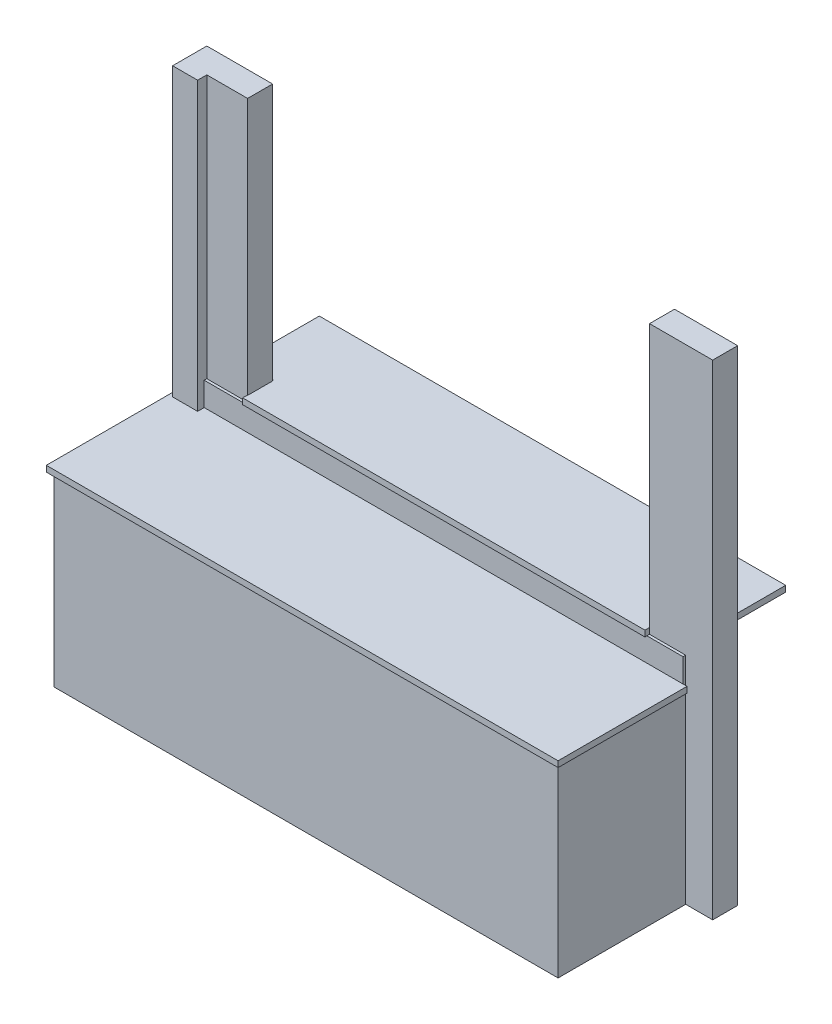
ISO-10303-21;
HEADER;
FILE_DESCRIPTION(('STEP AP214'),'2;1');
FILE_NAME('part.step','',(''),(''),'','','');
FILE_SCHEMA(('AUTOMOTIVE_DESIGN { 1 0 10303 214 1 1 1 1 }'));
ENDSEC;
DATA;
#1=APPLICATION_CONTEXT('core data for automotive mechanical design processes');
#2=APPLICATION_PROTOCOL_DEFINITION('international standard','automotive_design',2000,#1);
#3=PRODUCT_CONTEXT('',#1,'mechanical');
#4=PRODUCT('Part','Part','',(#3));
#5=PRODUCT_RELATED_PRODUCT_CATEGORY('part','',(#4));
#6=PRODUCT_DEFINITION_FORMATION('','',#4);
#7=PRODUCT_DEFINITION_CONTEXT('part definition',#1,'design');
#8=PRODUCT_DEFINITION('design','',#6,#7);
#9=PRODUCT_DEFINITION_SHAPE('','',#8);
#10=(LENGTH_UNIT() NAMED_UNIT(*) SI_UNIT(.MILLI.,.METRE.));
#11=(NAMED_UNIT(*) PLANE_ANGLE_UNIT() SI_UNIT($,.RADIAN.));
#12=(NAMED_UNIT(*) SI_UNIT($,.STERADIAN.) SOLID_ANGLE_UNIT());
#13=UNCERTAINTY_MEASURE_WITH_UNIT(LENGTH_MEASURE(1.E-05),#10,'distance_accuracy_value','');
#14=(GEOMETRIC_REPRESENTATION_CONTEXT(3) GLOBAL_UNCERTAINTY_ASSIGNED_CONTEXT((#13)) GLOBAL_UNIT_ASSIGNED_CONTEXT((#10,
#11,#12)) REPRESENTATION_CONTEXT('',''));
#15=CARTESIAN_POINT('',(0.,0.,0.));
#16=DIRECTION('',(0.,0.,1.));
#17=DIRECTION('',(1.,0.,0.));
#18=AXIS2_PLACEMENT_3D('',#15,#16,#17);
#19=CARTESIAN_POINT('',(1041.4,142.875,-301.625));
#20=DIRECTION('',(-1.,0.,0.));
#21=DIRECTION('',(0.,0.,1.));
#22=AXIS2_PLACEMENT_3D('',#19,#20,#21);
#23=PLANE('',#22);
#24=DIRECTION('',(0.,0.,-1.));
#25=VECTOR('',#24,1.);
#26=CARTESIAN_POINT('',(1041.4,114.3,-301.625));
#27=LINE('',#26,#25);
#28=CARTESIAN_POINT('',(1041.4,114.3,-311.15));
#29=VERTEX_POINT('',#28);
#30=CARTESIAN_POINT('',(1041.4,114.3,-323.85));
#31=VERTEX_POINT('',#30);
#32=EDGE_CURVE('E377',#29,#31,#27,.T.);
#33=ORIENTED_EDGE('',*,*,#32,.T.);
#34=DIRECTION('',(0.,1.,0.));
#35=VECTOR('',#34,1.);
#36=CARTESIAN_POINT('',(1041.4,-1254.91010127816,-323.85));
#37=LINE('',#36,#35);
#38=CARTESIAN_POINT('',(1041.4,142.875,-323.85));
#39=VERTEX_POINT('',#38);
#40=EDGE_CURVE('E260',#31,#39,#37,.T.);
#41=ORIENTED_EDGE('',*,*,#40,.T.);
#42=DIRECTION('',(0.,0.,-1.));
#43=VECTOR('',#42,1.);
#44=CARTESIAN_POINT('',(1041.4,142.875,-301.625));
#45=LINE('',#44,#43);
#46=CARTESIAN_POINT('',(1041.4,142.875,-301.625));
#47=VERTEX_POINT('',#46);
#48=EDGE_CURVE('E351',#47,#39,#45,.T.);
#49=ORIENTED_EDGE('',*,*,#48,.F.);
#50=DIRECTION('',(0.,-1.,0.));
#51=VECTOR('',#50,1.);
#52=CARTESIAN_POINT('',(1041.4,142.875,-301.625));
#53=LINE('',#52,#51);
#54=CARTESIAN_POINT('',(1041.4,114.3,-301.625));
#55=VERTEX_POINT('',#54);
#56=EDGE_CURVE('E393',#47,#55,#53,.T.);
#57=ORIENTED_EDGE('',*,*,#56,.T.);
#58=EDGE_CURVE('E373',#55,#29,#27,.T.);
#59=ORIENTED_EDGE('',*,*,#58,.T.);
#60=EDGE_LOOP('',(#33,#41,#49,#57,#59));
#61=FACE_BOUND('',#60,.T.);
#62=ADVANCED_FACE('F39',(#61),#23,.F.);
#63=CARTESIAN_POINT('',(-900.1125,142.875,-450.85));
#64=DIRECTION('',(1.,0.,0.));
#65=DIRECTION('',(0.,0.,-1.));
#66=AXIS2_PLACEMENT_3D('',#63,#64,#65);
#67=PLANE('',#66);
#68=DIRECTION('',(0.,0.,1.));
#69=VECTOR('',#68,1.);
#70=CARTESIAN_POINT('',(-900.1125,114.3,-450.85));
#71=LINE('',#70,#69);
#72=CARTESIAN_POINT('',(-900.1125,114.3,-450.85));
#73=VERTEX_POINT('',#72);
#74=CARTESIAN_POINT('',(-900.1125,114.3,-444.5));
#75=VERTEX_POINT('',#74);
#76=EDGE_CURVE('E366',#73,#75,#71,.T.);
#77=ORIENTED_EDGE('',*,*,#76,.T.);
#78=DIRECTION('',(0.,1.,0.));
#79=VECTOR('',#78,1.);
#80=CARTESIAN_POINT('',(-900.1125,142.875,-444.5));
#81=LINE('',#80,#79);
#82=CARTESIAN_POINT('',(-900.1125,142.875,-444.5));
#83=VERTEX_POINT('',#82);
#84=EDGE_CURVE('E333',#75,#83,#81,.T.);
#85=ORIENTED_EDGE('',*,*,#84,.T.);
#86=DIRECTION('',(0.,0.,1.));
#87=VECTOR('',#86,1.);
#88=CARTESIAN_POINT('',(-900.1125,142.875,-450.85));
#89=LINE('',#88,#87);
#90=CARTESIAN_POINT('',(-900.1125,142.875,-450.85));
#91=VERTEX_POINT('',#90);
#92=EDGE_CURVE('E345',#91,#83,#89,.T.);
#93=ORIENTED_EDGE('',*,*,#92,.F.);
#94=DIRECTION('',(0.,-1.,0.));
#95=VECTOR('',#94,1.);
#96=CARTESIAN_POINT('',(-900.1125,142.875,-450.85));
#97=LINE('',#96,#95);
#98=EDGE_CURVE('E399',#91,#73,#97,.T.);
#99=ORIENTED_EDGE('',*,*,#98,.T.);
#100=EDGE_LOOP('',(#77,#85,#93,#99));
#101=FACE_BOUND('',#100,.T.);
#102=ADVANCED_FACE('F566',(#101),#67,.F.);
#103=CARTESIAN_POINT('',(0.,114.3,0.));
#104=DIRECTION('',(0.,-1.,0.));
#105=DIRECTION('',(0.,0.,-1.));
#106=AXIS2_PLACEMENT_3D('',#103,#104,#105);
#107=PLANE('',#106);
#108=DIRECTION('',(0.,0.,1.));
#109=VECTOR('',#108,1.);
#110=CARTESIAN_POINT('',(1216.025,114.3,-311.15));
#111=LINE('',#110,#109);
#112=CARTESIAN_POINT('',(1216.025,114.3,-323.85));
#113=VERTEX_POINT('',#112);
#114=CARTESIAN_POINT('',(1216.025,114.3,-311.15));
#115=VERTEX_POINT('',#114);
#116=EDGE_CURVE('E408',#113,#115,#111,.T.);
#117=ORIENTED_EDGE('',*,*,#116,.F.);
#118=DIRECTION('',(-1.,0.,0.));
#119=VECTOR('',#118,1.);
#120=CARTESIAN_POINT('',(0.,114.3,-323.85));
#121=LINE('',#120,#119);
#122=EDGE_CURVE('E293',#113,#31,#121,.T.);
#123=ORIENTED_EDGE('',*,*,#122,.T.);
#124=ORIENTED_EDGE('',*,*,#32,.F.);
#125=DIRECTION('',(-1.,0.,0.));
#126=VECTOR('',#125,1.);
#127=CARTESIAN_POINT('',(1216.025,114.3,-311.15));
#128=LINE('',#127,#126);
#129=EDGE_CURVE('E409',#115,#29,#128,.T.);
#130=ORIENTED_EDGE('',*,*,#129,.F.);
#131=EDGE_LOOP('',(#117,#123,#124,#130));
#132=FACE_BOUND('',#131,.T.);
#133=ADVANCED_FACE('F588',(#132),#107,.F.);
#134=CARTESIAN_POINT('',(-900.1125,114.3,-323.85));
#135=VERTEX_POINT('',#134);
#136=CARTESIAN_POINT('',(-900.1125,114.3,-311.15));
#137=VERTEX_POINT('',#136);
#138=EDGE_CURVE('E370',#135,#137,#71,.T.);
#139=ORIENTED_EDGE('',*,*,#138,.F.);
#140=DIRECTION('',(-1.,0.,0.));
#141=VECTOR('',#140,1.);
#142=CARTESIAN_POINT('',(0.,114.3,-323.85));
#143=LINE('',#142,#141);
#144=CARTESIAN_POINT('',(-1095.375,114.3,-323.85));
#145=VERTEX_POINT('',#144);
#146=EDGE_CURVE('E62',#135,#145,#143,.T.);
#147=ORIENTED_EDGE('',*,*,#146,.T.);
#148=DIRECTION('',(0.,0.,1.));
#149=VECTOR('',#148,1.);
#150=CARTESIAN_POINT('',(-1095.375,114.3,0.));
#151=LINE('',#150,#149);
#152=CARTESIAN_POINT('',(-1095.375,114.3,-311.15));
#153=VERTEX_POINT('',#152);
#154=EDGE_CURVE('E335',#145,#153,#151,.T.);
#155=ORIENTED_EDGE('',*,*,#154,.T.);
#156=EDGE_CURVE('E417',#137,#153,#128,.T.);
#157=ORIENTED_EDGE('',*,*,#156,.F.);
#158=EDGE_LOOP('',(#139,#147,#155,#157));
#159=FACE_BOUND('',#158,.T.);
#160=ADVANCED_FACE('F521',(#159),#107,.F.);
#161=CARTESIAN_POINT('',(-1235.075,-28.575,-311.15));
#162=DIRECTION('',(0.,0.,-1.));
#163=DIRECTION('',(-1.,0.,0.));
#164=AXIS2_PLACEMENT_3D('',#161,#162,#163);
#165=PLANE('',#164);
#166=DIRECTION('',(-1.,0.,0.));
#167=VECTOR('',#166,1.);
#168=CARTESIAN_POINT('',(-1235.075,0.,-311.15));
#169=LINE('',#168,#167);
#170=CARTESIAN_POINT('',(-1216.025,0.,-311.15));
#171=VERTEX_POINT('',#170);
#172=CARTESIAN_POINT('',(-1235.075,0.,-311.15));
#173=VERTEX_POINT('',#172);
#174=EDGE_CURVE('E468',#171,#173,#169,.T.);
#175=ORIENTED_EDGE('',*,*,#174,.F.);
#176=DIRECTION('',(0.,-1.,0.));
#177=VECTOR('',#176,1.);
#178=CARTESIAN_POINT('',(-1216.025,3591.40306585183,-311.15));
#179=LINE('',#178,#177);
#180=CARTESIAN_POINT('',(-1216.025,-28.575,-311.15));
#181=VERTEX_POINT('',#180);
#182=EDGE_CURVE('E415',#171,#181,#179,.T.);
#183=ORIENTED_EDGE('',*,*,#182,.T.);
#184=DIRECTION('',(-1.,0.,0.));
#185=VECTOR('',#184,1.);
#186=CARTESIAN_POINT('',(-1235.075,-28.575,-311.15));
#187=LINE('',#186,#185);
#188=CARTESIAN_POINT('',(-1235.075,-28.575,-311.15));
#189=VERTEX_POINT('',#188);
#190=EDGE_CURVE('E454',#181,#189,#187,.T.);
#191=ORIENTED_EDGE('',*,*,#190,.T.);
#192=DIRECTION('',(0.,1.,0.));
#193=VECTOR('',#192,1.);
#194=CARTESIAN_POINT('',(-1235.075,-28.575,-311.15));
#195=LINE('',#194,#193);
#196=EDGE_CURVE('E480',#189,#173,#195,.T.);
#197=ORIENTED_EDGE('',*,*,#196,.T.);
#198=EDGE_LOOP('',(#175,#183,#191,#197));
#199=FACE_BOUND('',#198,.T.);
#200=ADVANCED_FACE('F639',(#199),#165,.T.);
#201=CARTESIAN_POINT('',(1235.075,-28.575,-311.15));
#202=VERTEX_POINT('',#201);
#203=CARTESIAN_POINT('',(1216.025,-28.575,-311.15));
#204=VERTEX_POINT('',#203);
#205=EDGE_CURVE('E456',#202,#204,#187,.T.);
#206=ORIENTED_EDGE('',*,*,#205,.T.);
#207=DIRECTION('',(0.,-1.,0.));
#208=VECTOR('',#207,1.);
#209=CARTESIAN_POINT('',(1216.025,3591.40306585183,-311.15));
#210=LINE('',#209,#208);
#211=CARTESIAN_POINT('',(1216.025,0.,-311.15));
#212=VERTEX_POINT('',#211);
#213=EDGE_CURVE('E405',#212,#204,#210,.T.);
#214=ORIENTED_EDGE('',*,*,#213,.F.);
#215=CARTESIAN_POINT('',(1235.075,0.,-311.15));
#216=VERTEX_POINT('',#215);
#217=EDGE_CURVE('E469',#216,#212,#169,.T.);
#218=ORIENTED_EDGE('',*,*,#217,.F.);
#219=DIRECTION('',(0.,1.,0.));
#220=VECTOR('',#219,1.);
#221=CARTESIAN_POINT('',(1235.075,-28.575,-311.15));
#222=LINE('',#221,#220);
#223=EDGE_CURVE('E465',#202,#216,#222,.T.);
#224=ORIENTED_EDGE('',*,*,#223,.F.);
#225=EDGE_LOOP('',(#206,#214,#218,#224));
#226=FACE_BOUND('',#225,.T.);
#227=ADVANCED_FACE('F627',(#226),#165,.T.);
#228=CARTESIAN_POINT('',(0.,-28.575,0.));
#229=DIRECTION('',(0.,1.,0.));
#230=DIRECTION('',(0.,0.,1.));
#231=AXIS2_PLACEMENT_3D('',#228,#229,#230);
#232=PLANE('',#231);
#233=DIRECTION('',(0.,0.,-1.));
#234=VECTOR('',#233,1.);
#235=CARTESIAN_POINT('',(-1216.025,-28.575,292.1));
#236=LINE('',#235,#234);
#237=CARTESIAN_POINT('',(-1216.025,-28.575,292.1));
#238=VERTEX_POINT('',#237);
#239=EDGE_CURVE('E423',#238,#181,#236,.T.);
#240=ORIENTED_EDGE('',*,*,#239,.F.);
#241=DIRECTION('',(-1.,0.,0.));
#242=VECTOR('',#241,1.);
#243=CARTESIAN_POINT('',(-1216.025,-28.575,292.1));
#244=LINE('',#243,#242);
#245=CARTESIAN_POINT('',(1216.025,-28.575,292.1));
#246=VERTEX_POINT('',#245);
#247=EDGE_CURVE('E428',#246,#238,#244,.T.);
#248=ORIENTED_EDGE('',*,*,#247,.F.);
#249=DIRECTION('',(0.,0.,1.));
#250=VECTOR('',#249,1.);
#251=CARTESIAN_POINT('',(1216.025,-28.575,292.1));
#252=LINE('',#251,#250);
#253=EDGE_CURVE('E437',#204,#246,#252,.T.);
#254=ORIENTED_EDGE('',*,*,#253,.F.);
#255=ORIENTED_EDGE('',*,*,#205,.F.);
#256=DIRECTION('',(0.,0.,-1.));
#257=VECTOR('',#256,1.);
#258=CARTESIAN_POINT('',(1235.075,-28.575,-311.15));
#259=LINE('',#258,#257);
#260=CARTESIAN_POINT('',(1235.075,-28.575,311.15));
#261=VERTEX_POINT('',#260);
#262=EDGE_CURVE('E451',#261,#202,#259,.T.);
#263=ORIENTED_EDGE('',*,*,#262,.F.);
#264=DIRECTION('',(1.,0.,0.));
#265=VECTOR('',#264,1.);
#266=CARTESIAN_POINT('',(-1235.075,-28.575,311.15));
#267=LINE('',#266,#265);
#268=CARTESIAN_POINT('',(-1235.075,-28.575,311.15));
#269=VERTEX_POINT('',#268);
#270=EDGE_CURVE('E462',#269,#261,#267,.T.);
#271=ORIENTED_EDGE('',*,*,#270,.F.);
#272=DIRECTION('',(0.,0.,1.));
#273=VECTOR('',#272,1.);
#274=CARTESIAN_POINT('',(-1235.075,-28.575,-311.15));
#275=LINE('',#274,#273);
#276=EDGE_CURVE('E459',#189,#269,#275,.T.);
#277=ORIENTED_EDGE('',*,*,#276,.F.);
#278=ORIENTED_EDGE('',*,*,#190,.F.);
#279=EDGE_LOOP('',(#240,#248,#254,#255,#263,#271,#277,#278));
#280=FACE_BOUND('',#279,.T.);
#281=ADVANCED_FACE('F624',(#280),#232,.F.);
#282=CARTESIAN_POINT('',(1235.075,-28.575,-311.15));
#283=DIRECTION('',(1.,0.,0.));
#284=DIRECTION('',(0.,0.,-1.));
#285=AXIS2_PLACEMENT_3D('',#282,#283,#284);
#286=PLANE('',#285);
#287=DIRECTION('',(0.,0.,-1.));
#288=VECTOR('',#287,1.);
#289=CARTESIAN_POINT('',(1235.075,0.,-311.15));
#290=LINE('',#289,#288);
#291=CARTESIAN_POINT('',(1235.075,0.,311.15));
#292=VERTEX_POINT('',#291);
#293=EDGE_CURVE('E450',#292,#216,#290,.T.);
#294=ORIENTED_EDGE('',*,*,#293,.F.);
#295=DIRECTION('',(0.,1.,0.));
#296=VECTOR('',#295,1.);
#297=CARTESIAN_POINT('',(1235.075,-28.575,311.15));
#298=LINE('',#297,#296);
#299=EDGE_CURVE('E440',#261,#292,#298,.T.);
#300=ORIENTED_EDGE('',*,*,#299,.F.);
#301=ORIENTED_EDGE('',*,*,#262,.T.);
#302=ORIENTED_EDGE('',*,*,#223,.T.);
#303=EDGE_LOOP('',(#294,#300,#301,#302));
#304=FACE_BOUND('',#303,.T.);
#305=ADVANCED_FACE('F41',(#304),#286,.T.);
#306=CARTESIAN_POINT('',(-1235.075,-28.575,311.15));
#307=DIRECTION('',(0.,0.,1.));
#308=DIRECTION('',(1.,0.,0.));
#309=AXIS2_PLACEMENT_3D('',#306,#307,#308);
#310=PLANE('',#309);
#311=DIRECTION('',(1.,0.,0.));
#312=VECTOR('',#311,1.);
#313=CARTESIAN_POINT('',(-1235.075,0.,311.15));
#314=LINE('',#313,#312);
#315=CARTESIAN_POINT('',(-1235.075,0.,311.15));
#316=VERTEX_POINT('',#315);
#317=EDGE_CURVE('E455',#316,#292,#314,.T.);
#318=ORIENTED_EDGE('',*,*,#317,.F.);
#319=DIRECTION('',(0.,1.,0.));
#320=VECTOR('',#319,1.);
#321=CARTESIAN_POINT('',(-1235.075,-28.575,311.15));
#322=LINE('',#321,#320);
#323=EDGE_CURVE('E478',#269,#316,#322,.T.);
#324=ORIENTED_EDGE('',*,*,#323,.F.);
#325=ORIENTED_EDGE('',*,*,#270,.T.);
#326=ORIENTED_EDGE('',*,*,#299,.T.);
#327=EDGE_LOOP('',(#318,#324,#325,#326));
#328=FACE_BOUND('',#327,.T.);
#329=ADVANCED_FACE('F633',(#328),#310,.T.);
#330=CARTESIAN_POINT('',(-1235.075,-28.575,-311.15));
#331=DIRECTION('',(-1.,0.,0.));
#332=DIRECTION('',(0.,0.,1.));
#333=AXIS2_PLACEMENT_3D('',#330,#331,#332);
#334=PLANE('',#333);
#335=DIRECTION('',(0.,0.,1.));
#336=VECTOR('',#335,1.);
#337=CARTESIAN_POINT('',(-1235.075,0.,-311.15));
#338=LINE('',#337,#336);
#339=EDGE_CURVE('E472',#173,#316,#338,.T.);
#340=ORIENTED_EDGE('',*,*,#339,.F.);
#341=ORIENTED_EDGE('',*,*,#196,.F.);
#342=ORIENTED_EDGE('',*,*,#276,.T.);
#343=ORIENTED_EDGE('',*,*,#323,.T.);
#344=EDGE_LOOP('',(#340,#341,#342,#343));
#345=FACE_BOUND('',#344,.T.);
#346=ADVANCED_FACE('F631',(#345),#334,.T.);
#347=CARTESIAN_POINT('',(0.,0.,0.));
#348=DIRECTION('',(0.,1.,0.));
#349=DIRECTION('',(0.,0.,1.));
#350=AXIS2_PLACEMENT_3D('',#347,#348,#349);
#351=PLANE('',#350);
#352=DIRECTION('',(0.,0.,1.));
#353=VECTOR('',#352,1.);
#354=CARTESIAN_POINT('',(-1095.375,0.,-279.4));
#355=LINE('',#354,#353);
#356=CARTESIAN_POINT('',(-1095.375,0.,-311.15));
#357=VERTEX_POINT('',#356);
#358=CARTESIAN_POINT('',(-1095.375,0.,-279.4));
#359=VERTEX_POINT('',#358);
#360=EDGE_CURVE('E317',#357,#359,#355,.T.);
#361=ORIENTED_EDGE('',*,*,#360,.T.);
#362=DIRECTION('',(-1.,0.,0.));
#363=VECTOR('',#362,1.);
#364=CARTESIAN_POINT('',(-1216.025,0.,-279.4));
#365=LINE('',#364,#363);
#366=CARTESIAN_POINT('',(-1216.025,0.,-279.4));
#367=VERTEX_POINT('',#366);
#368=EDGE_CURVE('E315',#359,#367,#365,.T.);
#369=ORIENTED_EDGE('',*,*,#368,.T.);
#370=DIRECTION('',(0.,0.,-1.));
#371=VECTOR('',#370,1.);
#372=CARTESIAN_POINT('',(-1216.025,0.,-444.5));
#373=LINE('',#372,#371);
#374=EDGE_CURVE('E320',#367,#171,#373,.T.);
#375=ORIENTED_EDGE('',*,*,#374,.T.);
#376=ORIENTED_EDGE('',*,*,#174,.T.);
#377=ORIENTED_EDGE('',*,*,#339,.T.);
#378=ORIENTED_EDGE('',*,*,#317,.T.);
#379=ORIENTED_EDGE('',*,*,#293,.T.);
#380=ORIENTED_EDGE('',*,*,#217,.T.);
#381=DIRECTION('',(-1.,0.,0.));
#382=VECTOR('',#381,1.);
#383=CARTESIAN_POINT('',(0.,0.,-311.15));
#384=LINE('',#383,#382);
#385=EDGE_CURVE('E411',#212,#357,#384,.T.);
#386=ORIENTED_EDGE('',*,*,#385,.T.);
#387=EDGE_LOOP('',(#361,#369,#375,#376,#377,#378,#379,#380,#386));
#388=FACE_BOUND('',#387,.T.);
#389=ADVANCED_FACE('F622',(#388),#351,.T.);
#390=CARTESIAN_POINT('',(-1216.025,-927.1,292.1));
#391=DIRECTION('',(1.,0.,0.));
#392=DIRECTION('',(0.,0.,-1.));
#393=AXIS2_PLACEMENT_3D('',#390,#391,#392);
#394=PLANE('',#393);
#395=DIRECTION('',(0.,0.,1.));
#396=VECTOR('',#395,1.);
#397=CARTESIAN_POINT('',(-1216.025,1384.3,-444.5));
#398=LINE('',#397,#396);
#399=CARTESIAN_POINT('',(-1216.025,1384.3,-444.5));
#400=VERTEX_POINT('',#399);
#401=CARTESIAN_POINT('',(-1216.025,1384.3,-279.4));
#402=VERTEX_POINT('',#401);
#403=EDGE_CURVE('E299',#400,#402,#398,.T.);
#404=ORIENTED_EDGE('',*,*,#403,.F.);
#405=DIRECTION('',(0.,1.,0.));
#406=VECTOR('',#405,1.);
#407=CARTESIAN_POINT('',(-1216.025,-927.1,-444.5));
#408=LINE('',#407,#406);
#409=CARTESIAN_POINT('',(-1216.025,-927.1,-444.5));
#410=VERTEX_POINT('',#409);
#411=EDGE_CURVE('E448',#410,#400,#408,.T.);
#412=ORIENTED_EDGE('',*,*,#411,.F.);
#413=DIRECTION('',(0.,0.,-1.));
#414=VECTOR('',#413,1.);
#415=CARTESIAN_POINT('',(-1216.025,-927.1,292.1));
#416=LINE('',#415,#414);
#417=CARTESIAN_POINT('',(-1216.025,-927.1,292.1));
#418=VERTEX_POINT('',#417);
#419=EDGE_CURVE('E424',#418,#410,#416,.T.);
#420=ORIENTED_EDGE('',*,*,#419,.F.);
#421=DIRECTION('',(0.,1.,0.));
#422=VECTOR('',#421,1.);
#423=CARTESIAN_POINT('',(-1216.025,-927.1,292.1));
#424=LINE('',#423,#422);
#425=EDGE_CURVE('E434',#418,#238,#424,.T.);
#426=ORIENTED_EDGE('',*,*,#425,.T.);
#427=ORIENTED_EDGE('',*,*,#239,.T.);
#428=ORIENTED_EDGE('',*,*,#182,.F.);
#429=ORIENTED_EDGE('',*,*,#374,.F.);
#430=DIRECTION('',(0.,1.,0.));
#431=VECTOR('',#430,1.);
#432=CARTESIAN_POINT('',(-1216.025,-357.860671211576,-279.4));
#433=LINE('',#432,#431);
#434=EDGE_CURVE('E314',#367,#402,#433,.T.);
#435=ORIENTED_EDGE('',*,*,#434,.T.);
#436=EDGE_LOOP('',(#404,#412,#420,#426,#427,#428,#429,#435));
#437=FACE_BOUND('',#436,.T.);
#438=ADVANCED_FACE('F619',(#437),#394,.F.);
#439=CARTESIAN_POINT('',(-1216.025,-927.1,-444.5));
#440=DIRECTION('',(0.,0.,1.));
#441=DIRECTION('',(1.,0.,0.));
#442=AXIS2_PLACEMENT_3D('',#439,#440,#441);
#443=PLANE('',#442);
#444=DIRECTION('',(1.,0.,0.));
#445=VECTOR('',#444,1.);
#446=CARTESIAN_POINT('',(1216.025,114.3,-444.5));
#447=LINE('',#446,#445);
#448=CARTESIAN_POINT('',(1041.4,114.3,-444.5));
#449=VERTEX_POINT('',#448);
#450=EDGE_CURVE('E406',#75,#449,#447,.T.);
#451=ORIENTED_EDGE('',*,*,#450,.T.);
#452=DIRECTION('',(0.,1.,0.));
#453=VECTOR('',#452,1.);
#454=CARTESIAN_POINT('',(1041.4,-1254.91010127816,-444.5));
#455=LINE('',#454,#453);
#456=CARTESIAN_POINT('',(1041.4,142.875,-444.5));
#457=VERTEX_POINT('',#456);
#458=EDGE_CURVE('E54',#449,#457,#455,.T.);
#459=ORIENTED_EDGE('',*,*,#458,.T.);
#460=CARTESIAN_POINT('',(1041.4,1412.875,-444.5));
#461=VERTEX_POINT('',#460);
#462=EDGE_CURVE('E286',#457,#461,#455,.T.);
#463=ORIENTED_EDGE('',*,*,#462,.T.);
#464=DIRECTION('',(-1.,0.,0.));
#465=VECTOR('',#464,1.);
#466=CARTESIAN_POINT('',(1041.4,1412.875,-444.5));
#467=LINE('',#466,#465);
#468=CARTESIAN_POINT('',(1346.2,1412.875,-444.5));
#469=VERTEX_POINT('',#468);
#470=EDGE_CURVE('E275',#469,#461,#467,.T.);
#471=ORIENTED_EDGE('',*,*,#470,.F.);
#472=DIRECTION('',(0.,1.,0.));
#473=VECTOR('',#472,1.);
#474=CARTESIAN_POINT('',(1346.2,-1254.91010127816,-444.5));
#475=LINE('',#474,#473);
#476=CARTESIAN_POINT('',(1346.2,-927.1,-444.5));
#477=VERTEX_POINT('',#476);
#478=EDGE_CURVE('E285',#477,#469,#475,.T.);
#479=ORIENTED_EDGE('',*,*,#478,.F.);
#480=DIRECTION('',(1.,0.,0.));
#481=VECTOR('',#480,1.);
#482=CARTESIAN_POINT('',(-1216.025,-927.1,-444.5));
#483=LINE('',#482,#481);
#484=EDGE_CURVE('E427',#410,#477,#483,.T.);
#485=ORIENTED_EDGE('',*,*,#484,.F.);
#486=ORIENTED_EDGE('',*,*,#411,.T.);
#487=DIRECTION('',(-1.,0.,0.));
#488=VECTOR('',#487,1.);
#489=CARTESIAN_POINT('',(-898.525,1384.3,-444.5));
#490=LINE('',#489,#488);
#491=CARTESIAN_POINT('',(-898.525,1384.3,-444.5));
#492=VERTEX_POINT('',#491);
#493=EDGE_CURVE('E296',#492,#400,#490,.T.);
#494=ORIENTED_EDGE('',*,*,#493,.F.);
#495=DIRECTION('',(0.,1.,0.));
#496=VECTOR('',#495,1.);
#497=CARTESIAN_POINT('',(-898.525,-357.860671211576,-444.5));
#498=LINE('',#497,#496);
#499=CARTESIAN_POINT('',(-898.525,142.875,-444.5));
#500=VERTEX_POINT('',#499);
#501=EDGE_CURVE('E318',#500,#492,#498,.T.);
#502=ORIENTED_EDGE('',*,*,#501,.F.);
#503=DIRECTION('',(-1.,0.,0.));
#504=VECTOR('',#503,1.);
#505=CARTESIAN_POINT('',(0.,142.875,-444.5));
#506=LINE('',#505,#504);
#507=EDGE_CURVE('E47',#500,#83,#506,.T.);
#508=ORIENTED_EDGE('',*,*,#507,.T.);
#509=ORIENTED_EDGE('',*,*,#84,.F.);
#510=EDGE_LOOP('',(#451,#459,#463,#471,#479,#485,#486,#494,#502,#508,#509));
#511=FACE_BOUND('',#510,.T.);
#512=ADVANCED_FACE('F492',(#511),#443,.F.);
#513=CARTESIAN_POINT('',(1216.025,-927.1,292.1));
#514=DIRECTION('',(-1.,0.,0.));
#515=DIRECTION('',(0.,0.,1.));
#516=AXIS2_PLACEMENT_3D('',#513,#514,#515);
#517=PLANE('',#516);
#518=DIRECTION('',(0.,0.,1.));
#519=VECTOR('',#518,1.);
#520=CARTESIAN_POINT('',(1216.025,-927.1,292.1));
#521=LINE('',#520,#519);
#522=CARTESIAN_POINT('',(1216.025,-927.1,-323.85));
#523=VERTEX_POINT('',#522);
#524=CARTESIAN_POINT('',(1216.025,-927.1,292.1));
#525=VERTEX_POINT('',#524);
#526=EDGE_CURVE('E430',#523,#525,#521,.T.);
#527=ORIENTED_EDGE('',*,*,#526,.F.);
#528=DIRECTION('',(0.,1.,0.));
#529=VECTOR('',#528,1.);
#530=CARTESIAN_POINT('',(1216.025,-927.1,-323.85));
#531=LINE('',#530,#529);
#532=EDGE_CURVE('E290',#523,#113,#531,.T.);
#533=ORIENTED_EDGE('',*,*,#532,.T.);
#534=ORIENTED_EDGE('',*,*,#116,.T.);
#535=EDGE_CURVE('E412',#115,#212,#210,.T.);
#536=ORIENTED_EDGE('',*,*,#535,.T.);
#537=ORIENTED_EDGE('',*,*,#213,.T.);
#538=ORIENTED_EDGE('',*,*,#253,.T.);
#539=DIRECTION('',(0.,1.,0.));
#540=VECTOR('',#539,1.);
#541=CARTESIAN_POINT('',(1216.025,-927.1,292.1));
#542=LINE('',#541,#540);
#543=EDGE_CURVE('E445',#525,#246,#542,.T.);
#544=ORIENTED_EDGE('',*,*,#543,.F.);
#545=EDGE_LOOP('',(#527,#533,#534,#536,#537,#538,#544));
#546=FACE_BOUND('',#545,.T.);
#547=ADVANCED_FACE('F612',(#546),#517,.F.);
#548=CARTESIAN_POINT('',(-1216.025,-927.1,292.1));
#549=DIRECTION('',(0.,0.,-1.));
#550=DIRECTION('',(-1.,0.,0.));
#551=AXIS2_PLACEMENT_3D('',#548,#549,#550);
#552=PLANE('',#551);
#553=ORIENTED_EDGE('',*,*,#247,.T.);
#554=ORIENTED_EDGE('',*,*,#425,.F.);
#555=DIRECTION('',(-1.,0.,0.));
#556=VECTOR('',#555,1.);
#557=CARTESIAN_POINT('',(-1216.025,-927.1,292.1));
#558=LINE('',#557,#556);
#559=EDGE_CURVE('E432',#525,#418,#558,.T.);
#560=ORIENTED_EDGE('',*,*,#559,.F.);
#561=ORIENTED_EDGE('',*,*,#543,.T.);
#562=EDGE_LOOP('',(#553,#554,#560,#561));
#563=FACE_BOUND('',#562,.T.);
#564=ADVANCED_FACE('F608',(#563),#552,.F.);
#565=CARTESIAN_POINT('',(0.,-927.1,0.));
#566=DIRECTION('',(0.,-1.,0.));
#567=DIRECTION('',(0.,0.,-1.));
#568=AXIS2_PLACEMENT_3D('',#565,#566,#567);
#569=PLANE('',#568);
#570=ORIENTED_EDGE('',*,*,#484,.T.);
#571=DIRECTION('',(0.,0.,-1.));
#572=VECTOR('',#571,1.);
#573=CARTESIAN_POINT('',(1346.2,-927.1,-444.5));
#574=LINE('',#573,#572);
#575=CARTESIAN_POINT('',(1346.2,-927.1,-323.85));
#576=VERTEX_POINT('',#575);
#577=EDGE_CURVE('E282',#576,#477,#574,.T.);
#578=ORIENTED_EDGE('',*,*,#577,.F.);
#579=DIRECTION('',(1.,0.,0.));
#580=VECTOR('',#579,1.);
#581=CARTESIAN_POINT('',(1041.4,-927.1,-323.85));
#582=LINE('',#581,#580);
#583=EDGE_CURVE('E280',#523,#576,#582,.T.);
#584=ORIENTED_EDGE('',*,*,#583,.F.);
#585=ORIENTED_EDGE('',*,*,#526,.T.);
#586=ORIENTED_EDGE('',*,*,#559,.T.);
#587=ORIENTED_EDGE('',*,*,#419,.T.);
#588=EDGE_LOOP('',(#570,#578,#584,#585,#586,#587));
#589=FACE_BOUND('',#588,.T.);
#590=ADVANCED_FACE('F577',(#589),#569,.T.);
#591=CARTESIAN_POINT('',(1216.025,3591.40306585183,-311.15));
#592=DIRECTION('',(0.,0.,-1.));
#593=DIRECTION('',(-1.,0.,0.));
#594=AXIS2_PLACEMENT_3D('',#591,#592,#593);
#595=PLANE('',#594);
#596=ORIENTED_EDGE('',*,*,#156,.T.);
#597=DIRECTION('',(0.,-1.,0.));
#598=VECTOR('',#597,1.);
#599=CARTESIAN_POINT('',(-1095.375,3591.40306585183,-311.15));
#600=LINE('',#599,#598);
#601=EDGE_CURVE('E12',#153,#357,#600,.T.);
#602=ORIENTED_EDGE('',*,*,#601,.T.);
#603=ORIENTED_EDGE('',*,*,#385,.F.);
#604=ORIENTED_EDGE('',*,*,#535,.F.);
#605=ORIENTED_EDGE('',*,*,#129,.T.);
#606=EDGE_CURVE('E420',#29,#137,#128,.T.);
#607=ORIENTED_EDGE('',*,*,#606,.T.);
#608=EDGE_LOOP('',(#596,#602,#603,#604,#605,#607));
#609=FACE_BOUND('',#608,.T.);
#610=ADVANCED_FACE('F570',(#609),#595,.F.);
#611=CARTESIAN_POINT('',(0.,114.3,0.));
#612=DIRECTION('',(0.,1.,0.));
#613=DIRECTION('',(0.,0.,1.));
#614=AXIS2_PLACEMENT_3D('',#611,#612,#613);
#615=PLANE('',#614);
#616=ORIENTED_EDGE('',*,*,#450,.F.);
#617=ORIENTED_EDGE('',*,*,#76,.F.);
#618=DIRECTION('',(1.,0.,0.));
#619=VECTOR('',#618,1.);
#620=CARTESIAN_POINT('',(-1057.275,114.3,-450.85));
#621=LINE('',#620,#619);
#622=CARTESIAN_POINT('',(-1057.275,114.3,-450.85));
#623=VERTEX_POINT('',#622);
#624=EDGE_CURVE('E363',#623,#73,#621,.T.);
#625=ORIENTED_EDGE('',*,*,#624,.F.);
#626=DIRECTION('',(0.,0.,1.));
#627=VECTOR('',#626,1.);
#628=CARTESIAN_POINT('',(-1057.275,114.3,-828.675));
#629=LINE('',#628,#627);
#630=CARTESIAN_POINT('',(-1057.275,114.3,-828.675));
#631=VERTEX_POINT('',#630);
#632=EDGE_CURVE('E337',#631,#623,#629,.T.);
#633=ORIENTED_EDGE('',*,*,#632,.F.);
#634=DIRECTION('',(-1.,0.,0.));
#635=VECTOR('',#634,1.);
#636=CARTESIAN_POINT('',(-1057.275,114.3,-828.675));
#637=LINE('',#636,#635);
#638=CARTESIAN_POINT('',(1193.8,114.3,-828.675));
#639=VERTEX_POINT('',#638);
#640=EDGE_CURVE('E342',#639,#631,#637,.T.);
#641=ORIENTED_EDGE('',*,*,#640,.F.);
#642=DIRECTION('',(0.,0.,-1.));
#643=VECTOR('',#642,1.);
#644=CARTESIAN_POINT('',(1193.8,114.3,-828.675));
#645=LINE('',#644,#643);
#646=CARTESIAN_POINT('',(1193.8,114.3,-450.85));
#647=VERTEX_POINT('',#646);
#648=EDGE_CURVE('E379',#647,#639,#645,.T.);
#649=ORIENTED_EDGE('',*,*,#648,.F.);
#650=DIRECTION('',(1.,0.,0.));
#651=VECTOR('',#650,1.);
#652=CARTESIAN_POINT('',(1041.4,114.3,-450.85));
#653=LINE('',#652,#651);
#654=CARTESIAN_POINT('',(1041.4,114.3,-450.85));
#655=VERTEX_POINT('',#654);
#656=EDGE_CURVE('E376',#655,#647,#653,.T.);
#657=ORIENTED_EDGE('',*,*,#656,.F.);
#658=EDGE_CURVE('E372',#449,#655,#27,.T.);
#659=ORIENTED_EDGE('',*,*,#658,.F.);
#660=EDGE_LOOP('',(#616,#617,#625,#633,#641,#649,#657,#659));
#661=FACE_BOUND('',#660,.T.);
#662=ADVANCED_FACE('F568',(#661),#615,.F.);
#663=CARTESIAN_POINT('',(-1057.275,142.875,-828.675));
#664=DIRECTION('',(1.,0.,0.));
#665=DIRECTION('',(0.,0.,-1.));
#666=AXIS2_PLACEMENT_3D('',#663,#664,#665);
#667=PLANE('',#666);
#668=ORIENTED_EDGE('',*,*,#632,.T.);
#669=DIRECTION('',(0.,-1.,0.));
#670=VECTOR('',#669,1.);
#671=CARTESIAN_POINT('',(-1057.275,142.875,-450.85));
#672=LINE('',#671,#670);
#673=CARTESIAN_POINT('',(-1057.275,142.875,-450.85));
#674=VERTEX_POINT('',#673);
#675=EDGE_CURVE('E402',#674,#623,#672,.T.);
#676=ORIENTED_EDGE('',*,*,#675,.F.);
#677=DIRECTION('',(0.,0.,1.));
#678=VECTOR('',#677,1.);
#679=CARTESIAN_POINT('',(-1057.275,142.875,-828.675));
#680=LINE('',#679,#678);
#681=CARTESIAN_POINT('',(-1057.275,142.875,-828.675));
#682=VERTEX_POINT('',#681);
#683=EDGE_CURVE('E338',#682,#674,#680,.T.);
#684=ORIENTED_EDGE('',*,*,#683,.F.);
#685=DIRECTION('',(0.,-1.,0.));
#686=VECTOR('',#685,1.);
#687=CARTESIAN_POINT('',(-1057.275,142.875,-828.675));
#688=LINE('',#687,#686);
#689=EDGE_CURVE('E360',#682,#631,#688,.T.);
#690=ORIENTED_EDGE('',*,*,#689,.T.);
#691=EDGE_LOOP('',(#668,#676,#684,#690));
#692=FACE_BOUND('',#691,.T.);
#693=ADVANCED_FACE('F560',(#692),#667,.F.);
#694=CARTESIAN_POINT('',(-1057.275,142.875,-450.85));
#695=DIRECTION('',(0.,0.,-1.));
#696=DIRECTION('',(-1.,0.,0.));
#697=AXIS2_PLACEMENT_3D('',#694,#695,#696);
#698=PLANE('',#697);
#699=ORIENTED_EDGE('',*,*,#624,.T.);
#700=ORIENTED_EDGE('',*,*,#98,.F.);
#701=DIRECTION('',(1.,0.,0.));
#702=VECTOR('',#701,1.);
#703=CARTESIAN_POINT('',(-1057.275,142.875,-450.85));
#704=LINE('',#703,#702);
#705=EDGE_CURVE('E341',#674,#91,#704,.T.);
#706=ORIENTED_EDGE('',*,*,#705,.F.);
#707=ORIENTED_EDGE('',*,*,#675,.T.);
#708=EDGE_LOOP('',(#699,#700,#706,#707));
#709=FACE_BOUND('',#708,.T.);
#710=ADVANCED_FACE('F562',(#709),#698,.F.);
#711=CARTESIAN_POINT('',(-900.1125,142.875,-323.85));
#712=VERTEX_POINT('',#711);
#713=CARTESIAN_POINT('',(-900.1125,142.875,-301.625));
#714=VERTEX_POINT('',#713);
#715=EDGE_CURVE('E344',#712,#714,#89,.T.);
#716=ORIENTED_EDGE('',*,*,#715,.F.);
#717=DIRECTION('',(0.,-1.,0.));
#718=VECTOR('',#717,1.);
#719=CARTESIAN_POINT('',(-900.1125,142.875,-323.85));
#720=LINE('',#719,#718);
#721=EDGE_CURVE('E330',#712,#135,#720,.T.);
#722=ORIENTED_EDGE('',*,*,#721,.T.);
#723=ORIENTED_EDGE('',*,*,#138,.T.);
#724=CARTESIAN_POINT('',(-900.1125,114.3,-301.625));
#725=VERTEX_POINT('',#724);
#726=EDGE_CURVE('E365',#137,#725,#71,.T.);
#727=ORIENTED_EDGE('',*,*,#726,.T.);
#728=DIRECTION('',(0.,-1.,0.));
#729=VECTOR('',#728,1.);
#730=CARTESIAN_POINT('',(-900.1125,142.875,-301.625));
#731=LINE('',#730,#729);
#732=EDGE_CURVE('E396',#714,#725,#731,.T.);
#733=ORIENTED_EDGE('',*,*,#732,.F.);
#734=EDGE_LOOP('',(#716,#722,#723,#727,#733));
#735=FACE_BOUND('',#734,.T.);
#736=ADVANCED_FACE('F517',(#735),#67,.F.);
#737=CARTESIAN_POINT('',(-900.1125,142.875,-301.625));
#738=DIRECTION('',(0.,0.,-1.));
#739=DIRECTION('',(-1.,0.,0.));
#740=AXIS2_PLACEMENT_3D('',#737,#738,#739);
#741=PLANE('',#740);
#742=DIRECTION('',(1.,0.,0.));
#743=VECTOR('',#742,1.);
#744=CARTESIAN_POINT('',(-900.1125,114.3,-301.625));
#745=LINE('',#744,#743);
#746=EDGE_CURVE('E369',#725,#55,#745,.T.);
#747=ORIENTED_EDGE('',*,*,#746,.T.);
#748=ORIENTED_EDGE('',*,*,#56,.F.);
#749=DIRECTION('',(1.,0.,0.));
#750=VECTOR('',#749,1.);
#751=CARTESIAN_POINT('',(-900.1125,142.875,-301.625));
#752=LINE('',#751,#750);
#753=EDGE_CURVE('E348',#714,#47,#752,.T.);
#754=ORIENTED_EDGE('',*,*,#753,.F.);
#755=ORIENTED_EDGE('',*,*,#732,.T.);
#756=EDGE_LOOP('',(#747,#748,#754,#755));
#757=FACE_BOUND('',#756,.T.);
#758=ADVANCED_FACE('F530',(#757),#741,.F.);
#759=CARTESIAN_POINT('',(1041.4,142.875,-450.85));
#760=VERTEX_POINT('',#759);
#761=EDGE_CURVE('E350',#457,#760,#45,.T.);
#762=ORIENTED_EDGE('',*,*,#761,.F.);
#763=ORIENTED_EDGE('',*,*,#458,.F.);
#764=ORIENTED_EDGE('',*,*,#658,.T.);
#765=DIRECTION('',(0.,-1.,0.));
#766=VECTOR('',#765,1.);
#767=CARTESIAN_POINT('',(1041.4,142.875,-450.85));
#768=LINE('',#767,#766);
#769=EDGE_CURVE('E390',#760,#655,#768,.T.);
#770=ORIENTED_EDGE('',*,*,#769,.F.);
#771=EDGE_LOOP('',(#762,#763,#764,#770));
#772=FACE_BOUND('',#771,.T.);
#773=ADVANCED_FACE('F541',(#772),#23,.F.);
#774=CARTESIAN_POINT('',(1041.4,142.875,-450.85));
#775=DIRECTION('',(0.,0.,-1.));
#776=DIRECTION('',(-1.,0.,0.));
#777=AXIS2_PLACEMENT_3D('',#774,#775,#776);
#778=PLANE('',#777);
#779=ORIENTED_EDGE('',*,*,#656,.T.);
#780=DIRECTION('',(0.,-1.,0.));
#781=VECTOR('',#780,1.);
#782=CARTESIAN_POINT('',(1193.8,142.875,-450.85));
#783=LINE('',#782,#781);
#784=CARTESIAN_POINT('',(1193.8,142.875,-450.85));
#785=VERTEX_POINT('',#784);
#786=EDGE_CURVE('E387',#785,#647,#783,.T.);
#787=ORIENTED_EDGE('',*,*,#786,.F.);
#788=DIRECTION('',(1.,0.,0.));
#789=VECTOR('',#788,1.);
#790=CARTESIAN_POINT('',(1041.4,142.875,-450.85));
#791=LINE('',#790,#789);
#792=EDGE_CURVE('E354',#760,#785,#791,.T.);
#793=ORIENTED_EDGE('',*,*,#792,.F.);
#794=ORIENTED_EDGE('',*,*,#769,.T.);
#795=EDGE_LOOP('',(#779,#787,#793,#794));
#796=FACE_BOUND('',#795,.T.);
#797=ADVANCED_FACE('F545',(#796),#778,.F.);
#798=CARTESIAN_POINT('',(1193.8,142.875,-828.675));
#799=DIRECTION('',(-1.,0.,0.));
#800=DIRECTION('',(0.,0.,1.));
#801=AXIS2_PLACEMENT_3D('',#798,#799,#800);
#802=PLANE('',#801);
#803=ORIENTED_EDGE('',*,*,#648,.T.);
#804=DIRECTION('',(0.,-1.,0.));
#805=VECTOR('',#804,1.);
#806=CARTESIAN_POINT('',(1193.8,142.875,-828.675));
#807=LINE('',#806,#805);
#808=CARTESIAN_POINT('',(1193.8,142.875,-828.675));
#809=VERTEX_POINT('',#808);
#810=EDGE_CURVE('E384',#809,#639,#807,.T.);
#811=ORIENTED_EDGE('',*,*,#810,.F.);
#812=DIRECTION('',(0.,0.,-1.));
#813=VECTOR('',#812,1.);
#814=CARTESIAN_POINT('',(1193.8,142.875,-828.675));
#815=LINE('',#814,#813);
#816=EDGE_CURVE('E356',#785,#809,#815,.T.);
#817=ORIENTED_EDGE('',*,*,#816,.F.);
#818=ORIENTED_EDGE('',*,*,#786,.T.);
#819=EDGE_LOOP('',(#803,#811,#817,#818));
#820=FACE_BOUND('',#819,.T.);
#821=ADVANCED_FACE('F550',(#820),#802,.F.);
#822=CARTESIAN_POINT('',(-1057.275,142.875,-828.675));
#823=DIRECTION('',(0.,0.,1.));
#824=DIRECTION('',(1.,0.,0.));
#825=AXIS2_PLACEMENT_3D('',#822,#823,#824);
#826=PLANE('',#825);
#827=ORIENTED_EDGE('',*,*,#640,.T.);
#828=ORIENTED_EDGE('',*,*,#689,.F.);
#829=DIRECTION('',(-1.,0.,0.));
#830=VECTOR('',#829,1.);
#831=CARTESIAN_POINT('',(-1057.275,142.875,-828.675));
#832=LINE('',#831,#830);
#833=EDGE_CURVE('E358',#809,#682,#832,.T.);
#834=ORIENTED_EDGE('',*,*,#833,.F.);
#835=ORIENTED_EDGE('',*,*,#810,.T.);
#836=EDGE_LOOP('',(#827,#828,#834,#835));
#837=FACE_BOUND('',#836,.T.);
#838=ADVANCED_FACE('F556',(#837),#826,.F.);
#839=CARTESIAN_POINT('',(0.,142.875,0.));
#840=DIRECTION('',(0.,1.,0.));
#841=DIRECTION('',(0.,0.,1.));
#842=AXIS2_PLACEMENT_3D('',#839,#840,#841);
#843=PLANE('',#842);
#844=ORIENTED_EDGE('',*,*,#507,.F.);
#845=DIRECTION('',(0.,0.,-1.));
#846=VECTOR('',#845,1.);
#847=CARTESIAN_POINT('',(-898.525,142.875,0.));
#848=LINE('',#847,#846);
#849=CARTESIAN_POINT('',(-898.525,142.875,-323.85));
#850=VERTEX_POINT('',#849);
#851=EDGE_CURVE('E487',#850,#500,#848,.T.);
#852=ORIENTED_EDGE('',*,*,#851,.F.);
#853=DIRECTION('',(1.,0.,0.));
#854=VECTOR('',#853,1.);
#855=CARTESIAN_POINT('',(0.,142.875,-323.85));
#856=LINE('',#855,#854);
#857=EDGE_CURVE('E484',#712,#850,#856,.T.);
#858=ORIENTED_EDGE('',*,*,#857,.F.);
#859=ORIENTED_EDGE('',*,*,#715,.T.);
#860=ORIENTED_EDGE('',*,*,#753,.T.);
#861=ORIENTED_EDGE('',*,*,#48,.T.);
#862=EDGE_CURVE('E257',#39,#457,#45,.T.);
#863=ORIENTED_EDGE('',*,*,#862,.T.);
#864=ORIENTED_EDGE('',*,*,#761,.T.);
#865=ORIENTED_EDGE('',*,*,#792,.T.);
#866=ORIENTED_EDGE('',*,*,#816,.T.);
#867=ORIENTED_EDGE('',*,*,#833,.T.);
#868=ORIENTED_EDGE('',*,*,#683,.T.);
#869=ORIENTED_EDGE('',*,*,#705,.T.);
#870=ORIENTED_EDGE('',*,*,#92,.T.);
#871=EDGE_LOOP('',(#844,#852,#858,#859,#860,#861,#863,#864,#865,#866,#867,#868,#869,#870));
#872=FACE_BOUND('',#871,.T.);
#873=ADVANCED_FACE('F495',(#872),#843,.T.);
#874=ORIENTED_EDGE('',*,*,#606,.F.);
#875=ORIENTED_EDGE('',*,*,#58,.F.);
#876=ORIENTED_EDGE('',*,*,#746,.F.);
#877=ORIENTED_EDGE('',*,*,#726,.F.);
#878=EDGE_LOOP('',(#874,#875,#876,#877));
#879=FACE_BOUND('',#878,.T.);
#880=ADVANCED_FACE('F533',(#879),#615,.F.);
#881=CARTESIAN_POINT('',(-1095.375,-357.860671211576,-279.4));
#882=DIRECTION('',(1.,0.,0.));
#883=DIRECTION('',(0.,0.,-1.));
#884=AXIS2_PLACEMENT_3D('',#881,#882,#883);
#885=PLANE('',#884);
#886=ORIENTED_EDGE('',*,*,#154,.F.);
#887=DIRECTION('',(0.,1.,0.));
#888=VECTOR('',#887,1.);
#889=CARTESIAN_POINT('',(-1095.375,-357.860671211576,-323.85));
#890=LINE('',#889,#888);
#891=CARTESIAN_POINT('',(-1095.375,1384.3,-323.85));
#892=VERTEX_POINT('',#891);
#893=EDGE_CURVE('E324',#145,#892,#890,.T.);
#894=ORIENTED_EDGE('',*,*,#893,.T.);
#895=DIRECTION('',(0.,0.,-1.));
#896=VECTOR('',#895,1.);
#897=CARTESIAN_POINT('',(-1095.375,1384.3,-279.4));
#898=LINE('',#897,#896);
#899=CARTESIAN_POINT('',(-1095.375,1384.3,-279.4));
#900=VERTEX_POINT('',#899);
#901=EDGE_CURVE('E305',#900,#892,#898,.T.);
#902=ORIENTED_EDGE('',*,*,#901,.F.);
#903=DIRECTION('',(0.,1.,0.));
#904=VECTOR('',#903,1.);
#905=CARTESIAN_POINT('',(-1095.375,-357.860671211576,-279.4));
#906=LINE('',#905,#904);
#907=EDGE_CURVE('E326',#359,#900,#906,.T.);
#908=ORIENTED_EDGE('',*,*,#907,.F.);
#909=ORIENTED_EDGE('',*,*,#360,.F.);
#910=ORIENTED_EDGE('',*,*,#601,.F.);
#911=EDGE_LOOP('',(#886,#894,#902,#908,#909,#910));
#912=FACE_BOUND('',#911,.T.);
#913=ADVANCED_FACE('F512',(#912),#885,.T.);
#914=CARTESIAN_POINT('',(-1095.375,-357.860671211576,-323.85));
#915=DIRECTION('',(0.,0.,1.));
#916=DIRECTION('',(1.,0.,0.));
#917=AXIS2_PLACEMENT_3D('',#914,#915,#916);
#918=PLANE('',#917);
#919=ORIENTED_EDGE('',*,*,#146,.F.);
#920=ORIENTED_EDGE('',*,*,#721,.F.);
#921=ORIENTED_EDGE('',*,*,#857,.T.);
#922=DIRECTION('',(0.,1.,0.));
#923=VECTOR('',#922,1.);
#924=CARTESIAN_POINT('',(-898.525,-357.860671211576,-323.85));
#925=LINE('',#924,#923);
#926=CARTESIAN_POINT('',(-898.525,1384.3,-323.85));
#927=VERTEX_POINT('',#926);
#928=EDGE_CURVE('E322',#850,#927,#925,.T.);
#929=ORIENTED_EDGE('',*,*,#928,.T.);
#930=DIRECTION('',(1.,0.,0.));
#931=VECTOR('',#930,1.);
#932=CARTESIAN_POINT('',(-1095.375,1384.3,-323.85));
#933=LINE('',#932,#931);
#934=EDGE_CURVE('E308',#892,#927,#933,.T.);
#935=ORIENTED_EDGE('',*,*,#934,.F.);
#936=ORIENTED_EDGE('',*,*,#893,.F.);
#937=EDGE_LOOP('',(#919,#920,#921,#929,#935,#936));
#938=FACE_BOUND('',#937,.T.);
#939=ADVANCED_FACE('F503',(#938),#918,.T.);
#940=CARTESIAN_POINT('',(-898.525,-357.860671211576,-323.85));
#941=DIRECTION('',(1.,0.,0.));
#942=DIRECTION('',(0.,0.,-1.));
#943=AXIS2_PLACEMENT_3D('',#940,#941,#942);
#944=PLANE('',#943);
#945=ORIENTED_EDGE('',*,*,#928,.F.);
#946=ORIENTED_EDGE('',*,*,#851,.T.);
#947=ORIENTED_EDGE('',*,*,#501,.T.);
#948=DIRECTION('',(0.,0.,-1.));
#949=VECTOR('',#948,1.);
#950=CARTESIAN_POINT('',(-898.525,1384.3,-323.85));
#951=LINE('',#950,#949);
#952=EDGE_CURVE('E311',#927,#492,#951,.T.);
#953=ORIENTED_EDGE('',*,*,#952,.F.);
#954=EDGE_LOOP('',(#945,#946,#947,#953));
#955=FACE_BOUND('',#954,.T.);
#956=ADVANCED_FACE('F499',(#955),#944,.T.);
#957=CARTESIAN_POINT('',(-1216.025,-357.860671211576,-279.4));
#958=DIRECTION('',(0.,0.,1.));
#959=DIRECTION('',(1.,0.,0.));
#960=AXIS2_PLACEMENT_3D('',#957,#958,#959);
#961=PLANE('',#960);
#962=ORIENTED_EDGE('',*,*,#368,.F.);
#963=ORIENTED_EDGE('',*,*,#907,.T.);
#964=DIRECTION('',(1.,0.,0.));
#965=VECTOR('',#964,1.);
#966=CARTESIAN_POINT('',(-1216.025,1384.3,-279.4));
#967=LINE('',#966,#965);
#968=EDGE_CURVE('E302',#402,#900,#967,.T.);
#969=ORIENTED_EDGE('',*,*,#968,.F.);
#970=ORIENTED_EDGE('',*,*,#434,.F.);
#971=EDGE_LOOP('',(#962,#963,#969,#970));
#972=FACE_BOUND('',#971,.T.);
#973=ADVANCED_FACE('F681',(#972),#961,.T.);
#974=CARTESIAN_POINT('',(0.,1384.3,0.));
#975=DIRECTION('',(0.,1.,0.));
#976=DIRECTION('',(0.,0.,1.));
#977=AXIS2_PLACEMENT_3D('',#974,#975,#976);
#978=PLANE('',#977);
#979=ORIENTED_EDGE('',*,*,#493,.T.);
#980=ORIENTED_EDGE('',*,*,#403,.T.);
#981=ORIENTED_EDGE('',*,*,#968,.T.);
#982=ORIENTED_EDGE('',*,*,#901,.T.);
#983=ORIENTED_EDGE('',*,*,#934,.T.);
#984=ORIENTED_EDGE('',*,*,#952,.T.);
#985=EDGE_LOOP('',(#979,#980,#981,#982,#983,#984));
#986=FACE_BOUND('',#985,.T.);
#987=ADVANCED_FACE('F507',(#986),#978,.T.);
#988=CARTESIAN_POINT('',(1041.4,-1254.91010127816,-323.85));
#989=DIRECTION('',(0.,0.,1.));
#990=DIRECTION('',(1.,0.,0.));
#991=AXIS2_PLACEMENT_3D('',#988,#989,#990);
#992=PLANE('',#991);
#993=ORIENTED_EDGE('',*,*,#122,.F.);
#994=ORIENTED_EDGE('',*,*,#532,.F.);
#995=ORIENTED_EDGE('',*,*,#583,.T.);
#996=DIRECTION('',(0.,1.,0.));
#997=VECTOR('',#996,1.);
#998=CARTESIAN_POINT('',(1346.2,-1254.91010127816,-323.85));
#999=LINE('',#998,#997);
#1000=CARTESIAN_POINT('',(1346.2,1412.875,-323.85));
#1001=VERTEX_POINT('',#1000);
#1002=EDGE_CURVE('E266',#576,#1001,#999,.T.);
#1003=ORIENTED_EDGE('',*,*,#1002,.T.);
#1004=DIRECTION('',(1.,0.,0.));
#1005=VECTOR('',#1004,1.);
#1006=CARTESIAN_POINT('',(1041.4,1412.875,-323.85));
#1007=LINE('',#1006,#1005);
#1008=CARTESIAN_POINT('',(1041.4,1412.875,-323.85));
#1009=VERTEX_POINT('',#1008);
#1010=EDGE_CURVE('E263',#1009,#1001,#1007,.T.);
#1011=ORIENTED_EDGE('',*,*,#1010,.F.);
#1012=EDGE_CURVE('E251',#39,#1009,#37,.T.);
#1013=ORIENTED_EDGE('',*,*,#1012,.F.);
#1014=ORIENTED_EDGE('',*,*,#40,.F.);
#1015=EDGE_LOOP('',(#993,#994,#995,#1003,#1011,#1013,#1014));
#1016=FACE_BOUND('',#1015,.T.);
#1017=ADVANCED_FACE('F264',(#1016),#992,.T.);
#1018=CARTESIAN_POINT('',(1346.2,-1254.91010127816,-444.5));
#1019=DIRECTION('',(1.,0.,0.));
#1020=DIRECTION('',(0.,0.,-1.));
#1021=AXIS2_PLACEMENT_3D('',#1018,#1019,#1020);
#1022=PLANE('',#1021);
#1023=ORIENTED_EDGE('',*,*,#1002,.F.);
#1024=ORIENTED_EDGE('',*,*,#577,.T.);
#1025=ORIENTED_EDGE('',*,*,#478,.T.);
#1026=DIRECTION('',(0.,0.,-1.));
#1027=VECTOR('',#1026,1.);
#1028=CARTESIAN_POINT('',(1346.2,1412.875,-444.5));
#1029=LINE('',#1028,#1027);
#1030=EDGE_CURVE('E270',#1001,#469,#1029,.T.);
#1031=ORIENTED_EDGE('',*,*,#1030,.F.);
#1032=EDGE_LOOP('',(#1023,#1024,#1025,#1031));
#1033=FACE_BOUND('',#1032,.T.);
#1034=ADVANCED_FACE('F678',(#1033),#1022,.T.);
#1035=CARTESIAN_POINT('',(1041.4,-1254.91010127816,-444.5));
#1036=DIRECTION('',(-1.,0.,0.));
#1037=DIRECTION('',(0.,0.,1.));
#1038=AXIS2_PLACEMENT_3D('',#1035,#1036,#1037);
#1039=PLANE('',#1038);
#1040=ORIENTED_EDGE('',*,*,#462,.F.);
#1041=ORIENTED_EDGE('',*,*,#862,.F.);
#1042=ORIENTED_EDGE('',*,*,#1012,.T.);
#1043=DIRECTION('',(0.,0.,1.));
#1044=VECTOR('',#1043,1.);
#1045=CARTESIAN_POINT('',(1041.4,1412.875,-444.5));
#1046=LINE('',#1045,#1044);
#1047=EDGE_CURVE('E255',#461,#1009,#1046,.T.);
#1048=ORIENTED_EDGE('',*,*,#1047,.F.);
#1049=EDGE_LOOP('',(#1040,#1041,#1042,#1048));
#1050=FACE_BOUND('',#1049,.T.);
#1051=ADVANCED_FACE('F253',(#1050),#1039,.T.);
#1052=CARTESIAN_POINT('',(0.,1412.875,0.));
#1053=DIRECTION('',(0.,1.,0.));
#1054=DIRECTION('',(0.,0.,1.));
#1055=AXIS2_PLACEMENT_3D('',#1052,#1053,#1054);
#1056=PLANE('',#1055);
#1057=ORIENTED_EDGE('',*,*,#1047,.T.);
#1058=ORIENTED_EDGE('',*,*,#1010,.T.);
#1059=ORIENTED_EDGE('',*,*,#1030,.T.);
#1060=ORIENTED_EDGE('',*,*,#470,.T.);
#1061=EDGE_LOOP('',(#1057,#1058,#1059,#1060));
#1062=FACE_BOUND('',#1061,.T.);
#1063=ADVANCED_FACE('F273',(#1062),#1056,.T.);
#1064=CLOSED_SHELL('',(#62,#102,#133,#160,#200,#227,#281,#305,#329,#346,#389,#438,#512,#547,
#564,#590,#610,#662,#693,#710,#736,#758,#773,#797,#821,#838,#873,#880,#913,#939,#956,#973,#987,
#1017,#1034,#1051,#1063));
#1065=MANIFOLD_SOLID_BREP('B2',#1064);
#1066=ADVANCED_BREP_SHAPE_REPRESENTATION('',(#18,#1065),#14);
#1067=SHAPE_DEFINITION_REPRESENTATION(#9,#1066);
ENDSEC;
END-ISO-10303-21;
